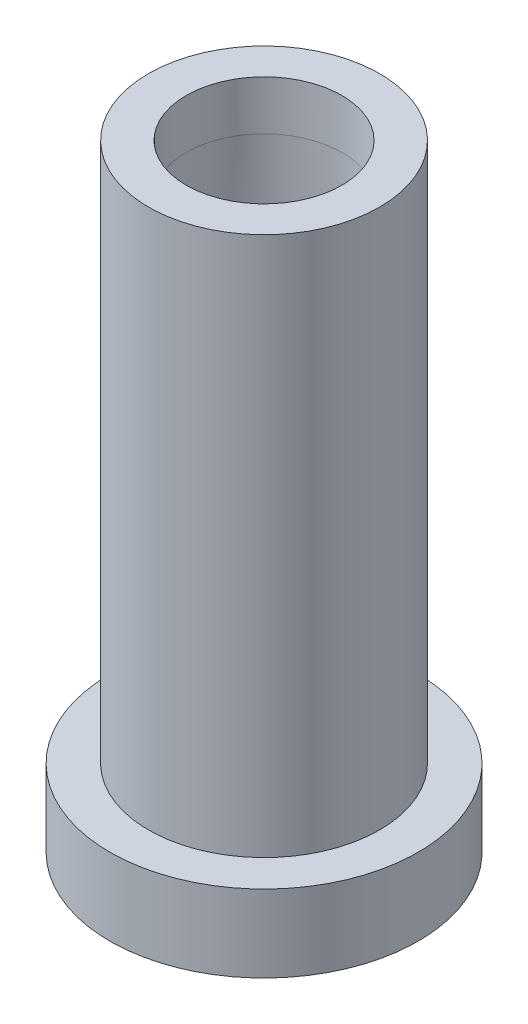
ISO-10303-21;
HEADER;
FILE_DESCRIPTION(('STEP AP214'),'2;1');
FILE_NAME('part.step','',(''),(''),'','','');
FILE_SCHEMA(('AUTOMOTIVE_DESIGN { 1 0 10303 214 1 1 1 1 }'));
ENDSEC;
DATA;
#1=APPLICATION_CONTEXT('core data for automotive mechanical design processes');
#2=APPLICATION_PROTOCOL_DEFINITION('international standard','automotive_design',2000,#1);
#3=PRODUCT_CONTEXT('',#1,'mechanical');
#4=PRODUCT('Part','Part','',(#3));
#5=PRODUCT_RELATED_PRODUCT_CATEGORY('part','',(#4));
#6=PRODUCT_DEFINITION_FORMATION('','',#4);
#7=PRODUCT_DEFINITION_CONTEXT('part definition',#1,'design');
#8=PRODUCT_DEFINITION('design','',#6,#7);
#9=PRODUCT_DEFINITION_SHAPE('','',#8);
#10=(LENGTH_UNIT() NAMED_UNIT(*) SI_UNIT(.MILLI.,.METRE.));
#11=(NAMED_UNIT(*) PLANE_ANGLE_UNIT() SI_UNIT($,.RADIAN.));
#12=(NAMED_UNIT(*) SI_UNIT($,.STERADIAN.) SOLID_ANGLE_UNIT());
#13=UNCERTAINTY_MEASURE_WITH_UNIT(LENGTH_MEASURE(1.E-05),#10,'distance_accuracy_value','');
#14=(GEOMETRIC_REPRESENTATION_CONTEXT(3) GLOBAL_UNCERTAINTY_ASSIGNED_CONTEXT((#13)) GLOBAL_UNIT_ASSIGNED_CONTEXT((#10,
#11,#12)) REPRESENTATION_CONTEXT('',''));
#15=CARTESIAN_POINT('',(0.,0.,0.));
#16=DIRECTION('',(0.,0.,1.));
#17=DIRECTION('',(1.,0.,0.));
#18=AXIS2_PLACEMENT_3D('',#15,#16,#17);
#19=CARTESIAN_POINT('',(0.,0.,0.));
#20=DIRECTION('',(0.,1.,0.));
#21=DIRECTION('',(-1.,0.,0.));
#22=AXIS2_PLACEMENT_3D('',#19,#20,#21);
#23=PLANE('',#22);
#24=CARTESIAN_POINT('',(0.,0.,0.));
#25=DIRECTION('',(0.,-1.,0.));
#26=DIRECTION('',(0.,0.,1.));
#27=AXIS2_PLACEMENT_3D('',#24,#25,#26);
#28=CIRCLE('',#27,6.01364191374583);
#29=CARTESIAN_POINT('',(0.,0.,6.01364191374583));
#30=VERTEX_POINT('',#29);
#31=CARTESIAN_POINT('',(6.01364191374583,0.,0.));
#32=VERTEX_POINT('',#31);
#33=EDGE_CURVE('E67',#30,#32,#28,.T.);
#34=ORIENTED_EDGE('',*,*,#33,.F.);
#35=CARTESIAN_POINT('',(0.,0.,0.));
#36=DIRECTION('',(0.,-1.,0.));
#37=DIRECTION('',(1.,0.,0.));
#38=AXIS2_PLACEMENT_3D('',#35,#36,#37);
#39=CIRCLE('',#38,6.01364191374583);
#40=EDGE_CURVE('E54',#32,#30,#39,.T.);
#41=ORIENTED_EDGE('',*,*,#40,.F.);
#42=EDGE_LOOP('',(#34,#41));
#43=FACE_BOUND('',#42,.T.);
#44=CARTESIAN_POINT('',(0.,0.,0.));
#45=DIRECTION('',(0.,1.,0.));
#46=DIRECTION('',(-1.,0.,0.));
#47=AXIS2_PLACEMENT_3D('',#44,#45,#46);
#48=CIRCLE('',#47,10.);
#49=CARTESIAN_POINT('',(-10.,0.,0.));
#50=VERTEX_POINT('',#49);
#51=EDGE_CURVE('E11',#50,#50,#48,.T.);
#52=ORIENTED_EDGE('',*,*,#51,.F.);
#53=EDGE_LOOP('',(#52));
#54=FACE_BOUND('',#53,.T.);
#55=ADVANCED_FACE('F40',(#43,#54),#23,.F.);
#56=CARTESIAN_POINT('',(0.,45.,0.));
#57=DIRECTION('',(0.,1.,0.));
#58=DIRECTION('',(-1.,0.,0.));
#59=AXIS2_PLACEMENT_3D('',#56,#57,#58);
#60=CYLINDRICAL_SURFACE('',#59,10.);
#61=CARTESIAN_POINT('',(0.,5.,0.));
#62=DIRECTION('',(0.,1.,0.));
#63=DIRECTION('',(-1.,0.,0.));
#64=AXIS2_PLACEMENT_3D('',#61,#62,#63);
#65=CIRCLE('',#64,10.);
#66=CARTESIAN_POINT('',(-10.,5.,0.));
#67=VERTEX_POINT('',#66);
#68=EDGE_CURVE('E47',#67,#67,#65,.T.);
#69=ORIENTED_EDGE('',*,*,#68,.F.);
#70=EDGE_LOOP('',(#69));
#71=FACE_BOUND('',#70,.T.);
#72=ORIENTED_EDGE('',*,*,#51,.T.);
#73=EDGE_LOOP('',(#72));
#74=FACE_BOUND('',#73,.T.);
#75=ADVANCED_FACE('F97',(#71,#74),#60,.T.);
#76=CARTESIAN_POINT('',(10.,5.,0.));
#77=DIRECTION('',(0.,-1.,0.));
#78=DIRECTION('',(1.,0.,0.));
#79=AXIS2_PLACEMENT_3D('',#76,#77,#78);
#80=PLANE('',#79);
#81=CARTESIAN_POINT('',(0.,5.,0.));
#82=DIRECTION('',(0.,1.,0.));
#83=DIRECTION('',(-1.,0.,0.));
#84=AXIS2_PLACEMENT_3D('',#81,#82,#83);
#85=CIRCLE('',#84,7.5);
#86=CARTESIAN_POINT('',(-7.5,5.,0.));
#87=VERTEX_POINT('',#86);
#88=EDGE_CURVE('E90',#87,#87,#85,.T.);
#89=ORIENTED_EDGE('',*,*,#88,.F.);
#90=EDGE_LOOP('',(#89));
#91=FACE_BOUND('',#90,.T.);
#92=ORIENTED_EDGE('',*,*,#68,.T.);
#93=EDGE_LOOP('',(#92));
#94=FACE_BOUND('',#93,.T.);
#95=ADVANCED_FACE('F95',(#91,#94),#80,.F.);
#96=CARTESIAN_POINT('',(0.,45.,0.));
#97=DIRECTION('',(0.,1.,0.));
#98=DIRECTION('',(-1.,0.,0.));
#99=AXIS2_PLACEMENT_3D('',#96,#97,#98);
#100=CYLINDRICAL_SURFACE('',#99,7.5);
#101=CARTESIAN_POINT('',(0.,40.,0.));
#102=DIRECTION('',(0.,1.,0.));
#103=DIRECTION('',(-1.,0.,0.));
#104=AXIS2_PLACEMENT_3D('',#101,#102,#103);
#105=CIRCLE('',#104,7.5);
#106=CARTESIAN_POINT('',(-7.50000000000001,40.,0.));
#107=VERTEX_POINT('',#106);
#108=EDGE_CURVE('E87',#107,#107,#105,.T.);
#109=ORIENTED_EDGE('',*,*,#108,.F.);
#110=EDGE_LOOP('',(#109));
#111=FACE_BOUND('',#110,.T.);
#112=ORIENTED_EDGE('',*,*,#88,.T.);
#113=EDGE_LOOP('',(#112));
#114=FACE_BOUND('',#113,.T.);
#115=ADVANCED_FACE('F142',(#111,#114),#100,.T.);
#116=CARTESIAN_POINT('',(7.5,40.,0.));
#117=DIRECTION('',(0.,-1.,0.));
#118=DIRECTION('',(1.,0.,0.));
#119=AXIS2_PLACEMENT_3D('',#116,#117,#118);
#120=PLANE('',#119);
#121=CARTESIAN_POINT('',(0.,40.,0.));
#122=DIRECTION('',(0.,1.,0.));
#123=DIRECTION('',(0.,0.,1.));
#124=AXIS2_PLACEMENT_3D('',#121,#122,#123);
#125=CIRCLE('',#124,5.05);
#126=CARTESIAN_POINT('',(0.,40.,5.05));
#127=VERTEX_POINT('',#126);
#128=EDGE_CURVE('E83',#127,#127,#125,.T.);
#129=ORIENTED_EDGE('',*,*,#128,.F.);
#130=EDGE_LOOP('',(#129));
#131=FACE_BOUND('',#130,.T.);
#132=ORIENTED_EDGE('',*,*,#108,.T.);
#133=EDGE_LOOP('',(#132));
#134=FACE_BOUND('',#133,.T.);
#135=ADVANCED_FACE('F110',(#131,#134),#120,.F.);
#136=CARTESIAN_POINT('',(0.,-0.001000000000001,0.));
#137=DIRECTION('',(0.,1.,0.));
#138=DIRECTION('',(0.,0.,1.));
#139=AXIS2_PLACEMENT_3D('',#136,#137,#138);
#140=CYLINDRICAL_SURFACE('',#139,5.05);
#141=CARTESIAN_POINT('',(0.,36.8,0.));
#142=DIRECTION('',(0.,-1.,0.));
#143=DIRECTION('',(1.,0.,0.));
#144=AXIS2_PLACEMENT_3D('',#141,#142,#143);
#145=CIRCLE('',#144,5.05);
#146=CARTESIAN_POINT('',(5.05,36.8,0.));
#147=VERTEX_POINT('',#146);
#148=CARTESIAN_POINT('',(0.,36.8,5.05));
#149=VERTEX_POINT('',#148);
#150=EDGE_CURVE('E73',#147,#149,#145,.T.);
#151=ORIENTED_EDGE('',*,*,#150,.T.);
#152=CARTESIAN_POINT('',(0.,36.8,0.));
#153=DIRECTION('',(0.,-1.,0.));
#154=DIRECTION('',(0.,0.,1.));
#155=AXIS2_PLACEMENT_3D('',#152,#153,#154);
#156=CIRCLE('',#155,5.05);
#157=EDGE_CURVE('E72',#149,#147,#156,.T.);
#158=ORIENTED_EDGE('',*,*,#157,.T.);
#159=EDGE_LOOP('',(#151,#158));
#160=FACE_BOUND('',#159,.T.);
#161=ORIENTED_EDGE('',*,*,#128,.T.);
#162=EDGE_LOOP('',(#161));
#163=FACE_BOUND('',#162,.T.);
#164=ADVANCED_FACE('F114',(#160,#163),#140,.F.);
#165=CARTESIAN_POINT('',(0.,0.,0.));
#166=DIRECTION('',(0.,-1.,0.));
#167=DIRECTION('',(0.,0.,-1.));
#168=AXIS2_PLACEMENT_3D('',#165,#166,#167);
#169=CONICAL_SURFACE('',#168,6.01364191374583,0.0261799387799081);
#170=ORIENTED_EDGE('',*,*,#150,.F.);
#171=DIRECTION('',(-0.0261769483078663,0.999657324975557,0.));
#172=VECTOR('',#171,1.);
#173=CARTESIAN_POINT('',(5.05,36.8,0.));
#174=LINE('',#173,#172);
#175=EDGE_CURVE('E69',#32,#147,#174,.T.);
#176=ORIENTED_EDGE('',*,*,#175,.F.);
#177=ORIENTED_EDGE('',*,*,#40,.T.);
#178=DIRECTION('',(0.,0.999657324975557,-0.0261769483078663));
#179=VECTOR('',#178,1.);
#180=CARTESIAN_POINT('',(0.,36.8,5.05));
#181=LINE('',#180,#179);
#182=EDGE_CURVE('E58',#30,#149,#181,.T.);
#183=ORIENTED_EDGE('',*,*,#182,.T.);
#184=EDGE_LOOP('',(#170,#176,#177,#183));
#185=FACE_BOUND('',#184,.T.);
#186=ADVANCED_FACE('F75',(#185),#169,.F.);
#187=CARTESIAN_POINT('',(0.,0.,0.));
#188=DIRECTION('',(0.,-1.,0.));
#189=DIRECTION('',(0.,0.,-1.));
#190=AXIS2_PLACEMENT_3D('',#187,#188,#189);
#191=CONICAL_SURFACE('',#190,6.01364191374583,0.0261799387799081);
#192=ORIENTED_EDGE('',*,*,#175,.T.);
#193=ORIENTED_EDGE('',*,*,#157,.F.);
#194=ORIENTED_EDGE('',*,*,#182,.F.);
#195=ORIENTED_EDGE('',*,*,#33,.T.);
#196=EDGE_LOOP('',(#192,#193,#194,#195));
#197=FACE_BOUND('',#196,.T.);
#198=ADVANCED_FACE('F68',(#197),#191,.F.);
#199=CLOSED_SHELL('',(#55,#75,#95,#115,#135,#164,#186,#198));
#200=MANIFOLD_SOLID_BREP('B2',#199);
#201=ADVANCED_BREP_SHAPE_REPRESENTATION('',(#18,#200),#14);
#202=SHAPE_DEFINITION_REPRESENTATION(#9,#201);
ENDSEC;
END-ISO-10303-21;
